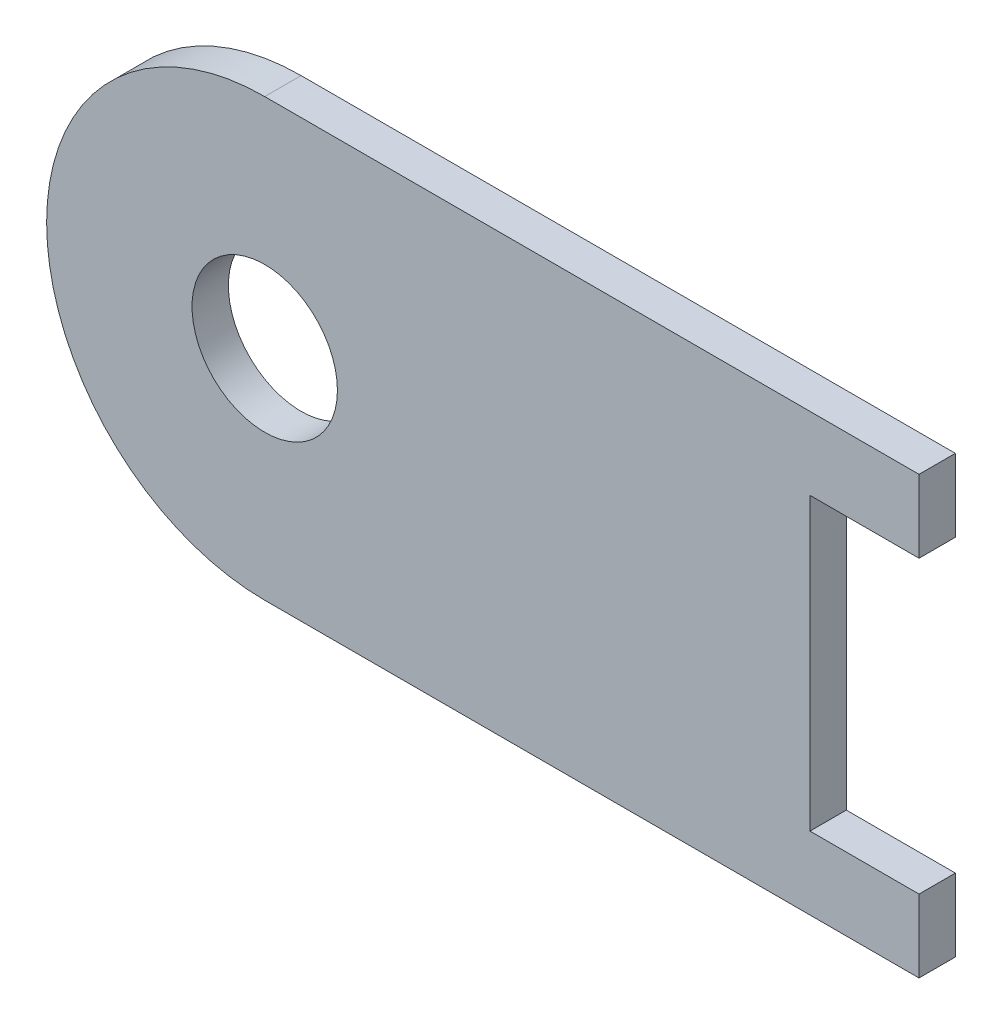
ISO-10303-21;
HEADER;
FILE_DESCRIPTION(('STEP AP214'),'2;1');
FILE_NAME('part.step','',(''),(''),'','','');
FILE_SCHEMA(('AUTOMOTIVE_DESIGN { 1 0 10303 214 1 1 1 1 }'));
ENDSEC;
DATA;
#1=APPLICATION_CONTEXT('core data for automotive mechanical design processes');
#2=APPLICATION_PROTOCOL_DEFINITION('international standard','automotive_design',2000,#1);
#3=PRODUCT_CONTEXT('',#1,'mechanical');
#4=PRODUCT('Part','Part','',(#3));
#5=PRODUCT_RELATED_PRODUCT_CATEGORY('part','',(#4));
#6=PRODUCT_DEFINITION_FORMATION('','',#4);
#7=PRODUCT_DEFINITION_CONTEXT('part definition',#1,'design');
#8=PRODUCT_DEFINITION('design','',#6,#7);
#9=PRODUCT_DEFINITION_SHAPE('','',#8);
#10=(LENGTH_UNIT() NAMED_UNIT(*) SI_UNIT(.MILLI.,.METRE.));
#11=(NAMED_UNIT(*) PLANE_ANGLE_UNIT() SI_UNIT($,.RADIAN.));
#12=(NAMED_UNIT(*) SI_UNIT($,.STERADIAN.) SOLID_ANGLE_UNIT());
#13=UNCERTAINTY_MEASURE_WITH_UNIT(LENGTH_MEASURE(1.E-05),#10,'distance_accuracy_value','');
#14=(GEOMETRIC_REPRESENTATION_CONTEXT(3) GLOBAL_UNCERTAINTY_ASSIGNED_CONTEXT((#13)) GLOBAL_UNIT_ASSIGNED_CONTEXT((#10,
#11,#12)) REPRESENTATION_CONTEXT('',''));
#15=CARTESIAN_POINT('',(0.,0.,0.));
#16=DIRECTION('',(0.,0.,1.));
#17=DIRECTION('',(1.,0.,0.));
#18=AXIS2_PLACEMENT_3D('',#15,#16,#17);
#19=CARTESIAN_POINT('',(-28.3201811461442,60.,10.));
#20=DIRECTION('',(0.,0.,1.));
#21=DIRECTION('',(1.,0.,0.));
#22=AXIS2_PLACEMENT_3D('',#19,#20,#21);
#23=PLANE('',#22);
#24=CARTESIAN_POINT('',(-28.3201811461442,60.,10.));
#25=DIRECTION('',(0.,0.,1.));
#26=DIRECTION('',(1.,0.,0.));
#27=AXIS2_PLACEMENT_3D('',#24,#25,#26);
#28=CIRCLE('',#27,60.);
#29=CARTESIAN_POINT('',(-28.3201811461442,120.,10.));
#30=VERTEX_POINT('',#29);
#31=CARTESIAN_POINT('',(-28.3201811461442,0.,10.));
#32=VERTEX_POINT('',#31);
#33=EDGE_CURVE('E144',#30,#32,#28,.T.);
#34=ORIENTED_EDGE('',*,*,#33,.T.);
#35=DIRECTION('',(1.,0.,0.));
#36=VECTOR('',#35,1.);
#37=CARTESIAN_POINT('',(-28.3201811461442,0.,10.));
#38=LINE('',#37,#36);
#39=CARTESIAN_POINT('',(151.679818853856,0.,10.));
#40=VERTEX_POINT('',#39);
#41=EDGE_CURVE('E92',#32,#40,#38,.T.);
#42=ORIENTED_EDGE('',*,*,#41,.T.);
#43=DIRECTION('',(0.,1.,0.));
#44=VECTOR('',#43,1.);
#45=CARTESIAN_POINT('',(151.679818853856,20.,10.));
#46=LINE('',#45,#44);
#47=CARTESIAN_POINT('',(151.679818853856,20.,10.));
#48=VERTEX_POINT('',#47);
#49=EDGE_CURVE('E159',#40,#48,#46,.T.);
#50=ORIENTED_EDGE('',*,*,#49,.T.);
#51=DIRECTION('',(-1.,0.,0.));
#52=VECTOR('',#51,1.);
#53=CARTESIAN_POINT('',(121.679818853856,20.,10.));
#54=LINE('',#53,#52);
#55=CARTESIAN_POINT('',(121.679818853856,20.,10.));
#56=VERTEX_POINT('',#55);
#57=EDGE_CURVE('E172',#48,#56,#54,.T.);
#58=ORIENTED_EDGE('',*,*,#57,.T.);
#59=DIRECTION('',(0.,1.,0.));
#60=VECTOR('',#59,1.);
#61=CARTESIAN_POINT('',(121.679818853856,100.,10.));
#62=LINE('',#61,#60);
#63=CARTESIAN_POINT('',(121.679818853856,100.,10.));
#64=VERTEX_POINT('',#63);
#65=EDGE_CURVE('E111',#56,#64,#62,.T.);
#66=ORIENTED_EDGE('',*,*,#65,.T.);
#67=DIRECTION('',(1.,0.,0.));
#68=VECTOR('',#67,1.);
#69=CARTESIAN_POINT('',(151.679818853856,100.,10.));
#70=LINE('',#69,#68);
#71=CARTESIAN_POINT('',(151.679818853856,100.,10.));
#72=VERTEX_POINT('',#71);
#73=EDGE_CURVE('E105',#64,#72,#70,.T.);
#74=ORIENTED_EDGE('',*,*,#73,.T.);
#75=DIRECTION('',(0.,1.,0.));
#76=VECTOR('',#75,1.);
#77=CARTESIAN_POINT('',(151.679818853856,120.,10.));
#78=LINE('',#77,#76);
#79=CARTESIAN_POINT('',(151.679818853856,120.,10.));
#80=VERTEX_POINT('',#79);
#81=EDGE_CURVE('E109',#72,#80,#78,.T.);
#82=ORIENTED_EDGE('',*,*,#81,.T.);
#83=DIRECTION('',(-1.,0.,0.));
#84=VECTOR('',#83,1.);
#85=CARTESIAN_POINT('',(-28.3201811461442,120.,10.));
#86=LINE('',#85,#84);
#87=EDGE_CURVE('E49',#80,#30,#86,.T.);
#88=ORIENTED_EDGE('',*,*,#87,.T.);
#89=EDGE_LOOP('',(#34,#42,#50,#58,#66,#74,#82,#88));
#90=FACE_BOUND('',#89,.T.);
#91=CARTESIAN_POINT('',(-28.3201811461442,60.,10.));
#92=DIRECTION('',(0.,0.,1.));
#93=DIRECTION('',(1.,0.,0.));
#94=AXIS2_PLACEMENT_3D('',#91,#92,#93);
#95=CIRCLE('',#94,20.);
#96=CARTESIAN_POINT('',(-8.3201811461442,60.,10.));
#97=VERTEX_POINT('',#96);
#98=EDGE_CURVE('E133',#97,#97,#95,.T.);
#99=ORIENTED_EDGE('',*,*,#98,.F.);
#100=EDGE_LOOP('',(#99));
#101=FACE_BOUND('',#100,.T.);
#102=ADVANCED_FACE('F32',(#90,#101),#23,.T.);
#103=CARTESIAN_POINT('',(-28.3201811461442,60.,0.));
#104=DIRECTION('',(0.,0.,1.));
#105=DIRECTION('',(1.,0.,0.));
#106=AXIS2_PLACEMENT_3D('',#103,#104,#105);
#107=PLANE('',#106);
#108=CARTESIAN_POINT('',(-28.3201811461442,60.,0.));
#109=DIRECTION('',(0.,0.,1.));
#110=DIRECTION('',(1.,0.,0.));
#111=AXIS2_PLACEMENT_3D('',#108,#109,#110);
#112=CIRCLE('',#111,60.);
#113=CARTESIAN_POINT('',(-28.3201811461442,120.,0.));
#114=VERTEX_POINT('',#113);
#115=CARTESIAN_POINT('',(-28.3201811461442,0.,0.));
#116=VERTEX_POINT('',#115);
#117=EDGE_CURVE('E129',#114,#116,#112,.T.);
#118=ORIENTED_EDGE('',*,*,#117,.F.);
#119=DIRECTION('',(-1.,0.,0.));
#120=VECTOR('',#119,1.);
#121=CARTESIAN_POINT('',(-28.3201811461442,120.,0.));
#122=LINE('',#121,#120);
#123=CARTESIAN_POINT('',(151.679818853856,120.,0.));
#124=VERTEX_POINT('',#123);
#125=EDGE_CURVE('E84',#124,#114,#122,.T.);
#126=ORIENTED_EDGE('',*,*,#125,.F.);
#127=DIRECTION('',(0.,1.,0.));
#128=VECTOR('',#127,1.);
#129=CARTESIAN_POINT('',(151.679818853856,120.,0.));
#130=LINE('',#129,#128);
#131=CARTESIAN_POINT('',(151.679818853856,100.,0.));
#132=VERTEX_POINT('',#131);
#133=EDGE_CURVE('E78',#132,#124,#130,.T.);
#134=ORIENTED_EDGE('',*,*,#133,.F.);
#135=DIRECTION('',(1.,0.,0.));
#136=VECTOR('',#135,1.);
#137=CARTESIAN_POINT('',(151.679818853856,100.,0.));
#138=LINE('',#137,#136);
#139=CARTESIAN_POINT('',(121.679818853856,100.,0.));
#140=VERTEX_POINT('',#139);
#141=EDGE_CURVE('E119',#140,#132,#138,.T.);
#142=ORIENTED_EDGE('',*,*,#141,.F.);
#143=DIRECTION('',(0.,1.,0.));
#144=VECTOR('',#143,1.);
#145=CARTESIAN_POINT('',(121.679818853856,100.,0.));
#146=LINE('',#145,#144);
#147=CARTESIAN_POINT('',(121.679818853856,20.,0.));
#148=VERTEX_POINT('',#147);
#149=EDGE_CURVE('E139',#148,#140,#146,.T.);
#150=ORIENTED_EDGE('',*,*,#149,.F.);
#151=DIRECTION('',(-1.,0.,0.));
#152=VECTOR('',#151,1.);
#153=CARTESIAN_POINT('',(121.679818853856,20.,0.));
#154=LINE('',#153,#152);
#155=CARTESIAN_POINT('',(151.679818853856,20.,0.));
#156=VERTEX_POINT('',#155);
#157=EDGE_CURVE('E137',#156,#148,#154,.T.);
#158=ORIENTED_EDGE('',*,*,#157,.F.);
#159=DIRECTION('',(0.,1.,0.));
#160=VECTOR('',#159,1.);
#161=CARTESIAN_POINT('',(151.679818853856,20.,0.));
#162=LINE('',#161,#160);
#163=CARTESIAN_POINT('',(151.679818853856,0.,0.));
#164=VERTEX_POINT('',#163);
#165=EDGE_CURVE('E135',#164,#156,#162,.T.);
#166=ORIENTED_EDGE('',*,*,#165,.F.);
#167=DIRECTION('',(1.,0.,0.));
#168=VECTOR('',#167,1.);
#169=CARTESIAN_POINT('',(-28.3201811461442,0.,0.));
#170=LINE('',#169,#168);
#171=EDGE_CURVE('E132',#116,#164,#170,.T.);
#172=ORIENTED_EDGE('',*,*,#171,.F.);
#173=EDGE_LOOP('',(#118,#126,#134,#142,#150,#158,#166,#172));
#174=FACE_BOUND('',#173,.T.);
#175=CARTESIAN_POINT('',(-28.3201811461442,60.,0.));
#176=DIRECTION('',(0.,0.,1.));
#177=DIRECTION('',(1.,0.,0.));
#178=AXIS2_PLACEMENT_3D('',#175,#176,#177);
#179=CIRCLE('',#178,20.);
#180=CARTESIAN_POINT('',(-8.3201811461442,60.,0.));
#181=VERTEX_POINT('',#180);
#182=EDGE_CURVE('E178',#181,#181,#179,.T.);
#183=ORIENTED_EDGE('',*,*,#182,.T.);
#184=EDGE_LOOP('',(#183));
#185=FACE_BOUND('',#184,.T.);
#186=ADVANCED_FACE('F163',(#174,#185),#107,.F.);
#187=CARTESIAN_POINT('',(-28.3201811461442,60.,10.));
#188=DIRECTION('',(0.,0.,-1.));
#189=DIRECTION('',(-1.,0.,0.));
#190=AXIS2_PLACEMENT_3D('',#187,#188,#189);
#191=CYLINDRICAL_SURFACE('',#190,60.);
#192=ORIENTED_EDGE('',*,*,#117,.T.);
#193=DIRECTION('',(0.,0.,-1.));
#194=VECTOR('',#193,1.);
#195=CARTESIAN_POINT('',(-28.3201811461442,0.,10.));
#196=LINE('',#195,#194);
#197=EDGE_CURVE('E11',#32,#116,#196,.T.);
#198=ORIENTED_EDGE('',*,*,#197,.F.);
#199=ORIENTED_EDGE('',*,*,#33,.F.);
#200=DIRECTION('',(0.,0.,-1.));
#201=VECTOR('',#200,1.);
#202=CARTESIAN_POINT('',(-28.3201811461442,120.,10.));
#203=LINE('',#202,#201);
#204=EDGE_CURVE('E125',#30,#114,#203,.T.);
#205=ORIENTED_EDGE('',*,*,#204,.T.);
#206=EDGE_LOOP('',(#192,#198,#199,#205));
#207=FACE_BOUND('',#206,.T.);
#208=ADVANCED_FACE('F34',(#207),#191,.T.);
#209=CARTESIAN_POINT('',(-28.3201811461442,0.,10.));
#210=DIRECTION('',(0.,1.,0.));
#211=DIRECTION('',(0.,0.,1.));
#212=AXIS2_PLACEMENT_3D('',#209,#210,#211);
#213=PLANE('',#212);
#214=ORIENTED_EDGE('',*,*,#171,.T.);
#215=DIRECTION('',(0.,0.,-1.));
#216=VECTOR('',#215,1.);
#217=CARTESIAN_POINT('',(151.679818853856,0.,10.));
#218=LINE('',#217,#216);
#219=EDGE_CURVE('E41',#40,#164,#218,.T.);
#220=ORIENTED_EDGE('',*,*,#219,.F.);
#221=ORIENTED_EDGE('',*,*,#41,.F.);
#222=ORIENTED_EDGE('',*,*,#197,.T.);
#223=EDGE_LOOP('',(#214,#220,#221,#222));
#224=FACE_BOUND('',#223,.T.);
#225=ADVANCED_FACE('F206',(#224),#213,.F.);
#226=CARTESIAN_POINT('',(151.679818853856,20.,10.));
#227=DIRECTION('',(-1.,0.,0.));
#228=DIRECTION('',(0.,0.,1.));
#229=AXIS2_PLACEMENT_3D('',#226,#227,#228);
#230=PLANE('',#229);
#231=ORIENTED_EDGE('',*,*,#165,.T.);
#232=DIRECTION('',(0.,0.,-1.));
#233=VECTOR('',#232,1.);
#234=CARTESIAN_POINT('',(151.679818853856,20.,10.));
#235=LINE('',#234,#233);
#236=EDGE_CURVE('E151',#48,#156,#235,.T.);
#237=ORIENTED_EDGE('',*,*,#236,.F.);
#238=ORIENTED_EDGE('',*,*,#49,.F.);
#239=ORIENTED_EDGE('',*,*,#219,.T.);
#240=EDGE_LOOP('',(#231,#237,#238,#239));
#241=FACE_BOUND('',#240,.T.);
#242=ADVANCED_FACE('F157',(#241),#230,.F.);
#243=CARTESIAN_POINT('',(121.679818853856,20.,10.));
#244=DIRECTION('',(0.,-1.,0.));
#245=DIRECTION('',(1.,0.,0.));
#246=AXIS2_PLACEMENT_3D('',#243,#244,#245);
#247=PLANE('',#246);
#248=ORIENTED_EDGE('',*,*,#157,.T.);
#249=DIRECTION('',(0.,0.,-1.));
#250=VECTOR('',#249,1.);
#251=CARTESIAN_POINT('',(121.679818853856,20.,10.));
#252=LINE('',#251,#250);
#253=EDGE_CURVE('E148',#56,#148,#252,.T.);
#254=ORIENTED_EDGE('',*,*,#253,.F.);
#255=ORIENTED_EDGE('',*,*,#57,.F.);
#256=ORIENTED_EDGE('',*,*,#236,.T.);
#257=EDGE_LOOP('',(#248,#254,#255,#256));
#258=FACE_BOUND('',#257,.T.);
#259=ADVANCED_FACE('F168',(#258),#247,.F.);
#260=CARTESIAN_POINT('',(121.679818853856,100.,10.));
#261=DIRECTION('',(-1.,0.,0.));
#262=DIRECTION('',(0.,-1.,0.));
#263=AXIS2_PLACEMENT_3D('',#260,#261,#262);
#264=PLANE('',#263);
#265=ORIENTED_EDGE('',*,*,#149,.T.);
#266=DIRECTION('',(0.,0.,-1.));
#267=VECTOR('',#266,1.);
#268=CARTESIAN_POINT('',(121.679818853856,100.,10.));
#269=LINE('',#268,#267);
#270=EDGE_CURVE('E120',#64,#140,#269,.T.);
#271=ORIENTED_EDGE('',*,*,#270,.F.);
#272=ORIENTED_EDGE('',*,*,#65,.F.);
#273=ORIENTED_EDGE('',*,*,#253,.T.);
#274=EDGE_LOOP('',(#265,#271,#272,#273));
#275=FACE_BOUND('',#274,.T.);
#276=ADVANCED_FACE('F171',(#275),#264,.F.);
#277=CARTESIAN_POINT('',(151.679818853856,100.,10.));
#278=DIRECTION('',(0.,1.,0.));
#279=DIRECTION('',(0.,0.,1.));
#280=AXIS2_PLACEMENT_3D('',#277,#278,#279);
#281=PLANE('',#280);
#282=ORIENTED_EDGE('',*,*,#141,.T.);
#283=DIRECTION('',(0.,0.,-1.));
#284=VECTOR('',#283,1.);
#285=CARTESIAN_POINT('',(151.679818853856,100.,10.));
#286=LINE('',#285,#284);
#287=EDGE_CURVE('E116',#72,#132,#286,.T.);
#288=ORIENTED_EDGE('',*,*,#287,.F.);
#289=ORIENTED_EDGE('',*,*,#73,.F.);
#290=ORIENTED_EDGE('',*,*,#270,.T.);
#291=EDGE_LOOP('',(#282,#288,#289,#290));
#292=FACE_BOUND('',#291,.T.);
#293=ADVANCED_FACE('F117',(#292),#281,.F.);
#294=CARTESIAN_POINT('',(151.679818853856,120.,10.));
#295=DIRECTION('',(-1.,0.,0.));
#296=DIRECTION('',(0.,0.,1.));
#297=AXIS2_PLACEMENT_3D('',#294,#295,#296);
#298=PLANE('',#297);
#299=ORIENTED_EDGE('',*,*,#133,.T.);
#300=DIRECTION('',(0.,0.,-1.));
#301=VECTOR('',#300,1.);
#302=CARTESIAN_POINT('',(151.679818853856,120.,10.));
#303=LINE('',#302,#301);
#304=EDGE_CURVE('E121',#80,#124,#303,.T.);
#305=ORIENTED_EDGE('',*,*,#304,.F.);
#306=ORIENTED_EDGE('',*,*,#81,.F.);
#307=ORIENTED_EDGE('',*,*,#287,.T.);
#308=EDGE_LOOP('',(#299,#305,#306,#307));
#309=FACE_BOUND('',#308,.T.);
#310=ADVANCED_FACE('F123',(#309),#298,.F.);
#311=CARTESIAN_POINT('',(-28.3201811461442,120.,10.));
#312=DIRECTION('',(0.,-1.,0.));
#313=DIRECTION('',(1.,0.,0.));
#314=AXIS2_PLACEMENT_3D('',#311,#312,#313);
#315=PLANE('',#314);
#316=ORIENTED_EDGE('',*,*,#125,.T.);
#317=ORIENTED_EDGE('',*,*,#204,.F.);
#318=ORIENTED_EDGE('',*,*,#87,.F.);
#319=ORIENTED_EDGE('',*,*,#304,.T.);
#320=EDGE_LOOP('',(#316,#317,#318,#319));
#321=FACE_BOUND('',#320,.T.);
#322=ADVANCED_FACE('F194',(#321),#315,.F.);
#323=CARTESIAN_POINT('',(-28.3201811461442,60.,10.));
#324=DIRECTION('',(0.,0.,-1.));
#325=DIRECTION('',(-1.,0.,0.));
#326=AXIS2_PLACEMENT_3D('',#323,#324,#325);
#327=CYLINDRICAL_SURFACE('',#326,20.);
#328=ORIENTED_EDGE('',*,*,#98,.T.);
#329=EDGE_LOOP('',(#328));
#330=FACE_BOUND('',#329,.T.);
#331=ORIENTED_EDGE('',*,*,#182,.F.);
#332=EDGE_LOOP('',(#331));
#333=FACE_BOUND('',#332,.T.);
#334=ADVANCED_FACE('F184',(#330,#333),#327,.F.);
#335=CLOSED_SHELL('',(#102,#186,#208,#225,#242,#259,#276,#293,#310,#322,#334));
#336=MANIFOLD_SOLID_BREP('B2',#335);
#337=ADVANCED_BREP_SHAPE_REPRESENTATION('',(#18,#336),#14);
#338=SHAPE_DEFINITION_REPRESENTATION(#9,#337);
ENDSEC;
END-ISO-10303-21;
